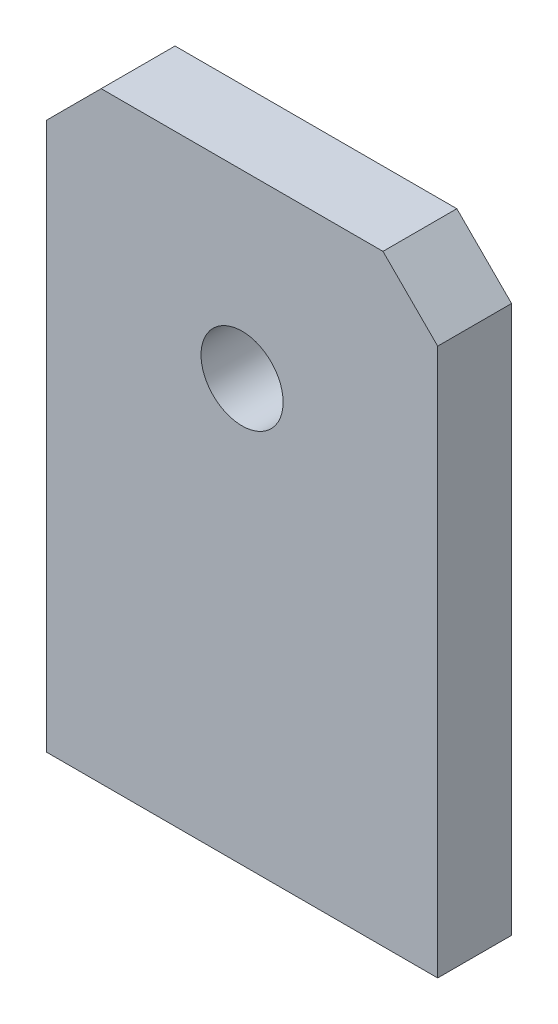
ISO-10303-21;
HEADER;
FILE_DESCRIPTION(('STEP AP214'),'2;1');
FILE_NAME('part.step','',(''),(''),'','','');
FILE_SCHEMA(('AUTOMOTIVE_DESIGN { 1 0 10303 214 1 1 1 1 }'));
ENDSEC;
DATA;
#1=APPLICATION_CONTEXT('core data for automotive mechanical design processes');
#2=APPLICATION_PROTOCOL_DEFINITION('international standard','automotive_design',2000,#1);
#3=PRODUCT_CONTEXT('',#1,'mechanical');
#4=PRODUCT('Part','Part','',(#3));
#5=PRODUCT_RELATED_PRODUCT_CATEGORY('part','',(#4));
#6=PRODUCT_DEFINITION_FORMATION('','',#4);
#7=PRODUCT_DEFINITION_CONTEXT('part definition',#1,'design');
#8=PRODUCT_DEFINITION('design','',#6,#7);
#9=PRODUCT_DEFINITION_SHAPE('','',#8);
#10=(LENGTH_UNIT() NAMED_UNIT(*) SI_UNIT(.MILLI.,.METRE.));
#11=(NAMED_UNIT(*) PLANE_ANGLE_UNIT() SI_UNIT($,.RADIAN.));
#12=(NAMED_UNIT(*) SI_UNIT($,.STERADIAN.) SOLID_ANGLE_UNIT());
#13=UNCERTAINTY_MEASURE_WITH_UNIT(LENGTH_MEASURE(1.E-05),#10,'distance_accuracy_value','');
#14=(GEOMETRIC_REPRESENTATION_CONTEXT(3) GLOBAL_UNCERTAINTY_ASSIGNED_CONTEXT((#13)) GLOBAL_UNIT_ASSIGNED_CONTEXT((#10,
#11,#12)) REPRESENTATION_CONTEXT('',''));
#15=CARTESIAN_POINT('',(0.,0.,0.));
#16=DIRECTION('',(0.,0.,1.));
#17=DIRECTION('',(1.,0.,0.));
#18=AXIS2_PLACEMENT_3D('',#15,#16,#17);
#19=CARTESIAN_POINT('',(0.,0.,13.5));
#20=DIRECTION('',(0.,0.,-1.));
#21=DIRECTION('',(-1.,0.,0.));
#22=AXIS2_PLACEMENT_3D('',#19,#20,#21);
#23=PLANE('',#22);
#24=DIRECTION('',(-1.,0.,0.));
#25=VECTOR('',#24,1.);
#26=CARTESIAN_POINT('',(0.,110.,13.5));
#27=LINE('',#26,#25);
#28=CARTESIAN_POINT('',(61.5,110.,13.5));
#29=VERTEX_POINT('',#28);
#30=CARTESIAN_POINT('',(10.,110.,13.5));
#31=VERTEX_POINT('',#30);
#32=EDGE_CURVE('E114',#29,#31,#27,.T.);
#33=ORIENTED_EDGE('',*,*,#32,.T.);
#34=DIRECTION('',(0.707106781186549,0.707106781186547,0.));
#35=VECTOR('',#34,1.);
#36=CARTESIAN_POINT('',(0.,100.,13.5));
#37=LINE('',#36,#35);
#38=CARTESIAN_POINT('',(0.,100.,13.5));
#39=VERTEX_POINT('',#38);
#40=EDGE_CURVE('E40',#31,#39,#37,.F.);
#41=ORIENTED_EDGE('',*,*,#40,.T.);
#42=DIRECTION('',(0.,-1.,0.));
#43=VECTOR('',#42,1.);
#44=CARTESIAN_POINT('',(0.,0.,13.5));
#45=LINE('',#44,#43);
#46=CARTESIAN_POINT('',(0.,0.,13.5));
#47=VERTEX_POINT('',#46);
#48=EDGE_CURVE('E86',#39,#47,#45,.T.);
#49=ORIENTED_EDGE('',*,*,#48,.T.);
#50=DIRECTION('',(1.,0.,0.));
#51=VECTOR('',#50,1.);
#52=CARTESIAN_POINT('',(0.,0.,13.5));
#53=LINE('',#52,#51);
#54=CARTESIAN_POINT('',(71.5,0.,13.5));
#55=VERTEX_POINT('',#54);
#56=EDGE_CURVE('E89',#47,#55,#53,.T.);
#57=ORIENTED_EDGE('',*,*,#56,.T.);
#58=DIRECTION('',(0.,1.,0.));
#59=VECTOR('',#58,1.);
#60=CARTESIAN_POINT('',(71.5,0.,13.5));
#61=LINE('',#60,#59);
#62=CARTESIAN_POINT('',(71.5,100.,13.5));
#63=VERTEX_POINT('',#62);
#64=EDGE_CURVE('E104',#55,#63,#61,.T.);
#65=ORIENTED_EDGE('',*,*,#64,.T.);
#66=DIRECTION('',(0.707106781186547,-0.707106781186549,0.));
#67=VECTOR('',#66,1.);
#68=CARTESIAN_POINT('',(61.5,110.,13.5));
#69=LINE('',#68,#67);
#70=EDGE_CURVE('E125',#63,#29,#69,.F.);
#71=ORIENTED_EDGE('',*,*,#70,.T.);
#72=EDGE_LOOP('',(#33,#41,#49,#57,#65,#71));
#73=FACE_BOUND('',#72,.T.);
#74=CARTESIAN_POINT('',(35.75,77.,13.5));
#75=DIRECTION('',(0.,0.,1.));
#76=DIRECTION('',(1.,0.,0.));
#77=AXIS2_PLACEMENT_3D('',#74,#75,#76);
#78=CIRCLE('',#77,7.5);
#79=CARTESIAN_POINT('',(43.25,77.,13.5));
#80=VERTEX_POINT('',#79);
#81=EDGE_CURVE('E142',#80,#80,#78,.T.);
#82=ORIENTED_EDGE('',*,*,#81,.F.);
#83=EDGE_LOOP('',(#82));
#84=FACE_BOUND('',#83,.T.);
#85=ADVANCED_FACE('F32',(#73,#84),#23,.F.);
#86=CARTESIAN_POINT('',(0.,0.,0.));
#87=DIRECTION('',(0.,0.,-1.));
#88=DIRECTION('',(-1.,0.,0.));
#89=AXIS2_PLACEMENT_3D('',#86,#87,#88);
#90=PLANE('',#89);
#91=DIRECTION('',(0.,-1.,0.));
#92=VECTOR('',#91,1.);
#93=CARTESIAN_POINT('',(0.,0.,0.));
#94=LINE('',#93,#92);
#95=CARTESIAN_POINT('',(0.,100.,0.));
#96=VERTEX_POINT('',#95);
#97=CARTESIAN_POINT('',(0.,0.,0.));
#98=VERTEX_POINT('',#97);
#99=EDGE_CURVE('E108',#96,#98,#94,.T.);
#100=ORIENTED_EDGE('',*,*,#99,.F.);
#101=DIRECTION('',(-0.707106781186549,-0.707106781186547,0.));
#102=VECTOR('',#101,1.);
#103=CARTESIAN_POINT('',(-50.,50.0000000000001,0.));
#104=LINE('',#103,#102);
#105=CARTESIAN_POINT('',(10.,110.,0.));
#106=VERTEX_POINT('',#105);
#107=EDGE_CURVE('E119',#96,#106,#104,.F.);
#108=ORIENTED_EDGE('',*,*,#107,.T.);
#109=DIRECTION('',(-1.,0.,0.));
#110=VECTOR('',#109,1.);
#111=CARTESIAN_POINT('',(0.,110.,0.));
#112=LINE('',#111,#110);
#113=CARTESIAN_POINT('',(61.5,110.,0.));
#114=VERTEX_POINT('',#113);
#115=EDGE_CURVE('E96',#114,#106,#112,.T.);
#116=ORIENTED_EDGE('',*,*,#115,.F.);
#117=DIRECTION('',(-0.707106781186547,0.707106781186549,0.));
#118=VECTOR('',#117,1.);
#119=CARTESIAN_POINT('',(85.7500000000001,85.7499999999998,0.));
#120=LINE('',#119,#118);
#121=CARTESIAN_POINT('',(71.5,100.,0.));
#122=VERTEX_POINT('',#121);
#123=EDGE_CURVE('E112',#114,#122,#120,.F.);
#124=ORIENTED_EDGE('',*,*,#123,.T.);
#125=DIRECTION('',(0.,1.,0.));
#126=VECTOR('',#125,1.);
#127=CARTESIAN_POINT('',(71.5,0.,0.));
#128=LINE('',#127,#126);
#129=CARTESIAN_POINT('',(71.5,0.,0.));
#130=VERTEX_POINT('',#129);
#131=EDGE_CURVE('E136',#130,#122,#128,.T.);
#132=ORIENTED_EDGE('',*,*,#131,.F.);
#133=DIRECTION('',(1.,0.,0.));
#134=VECTOR('',#133,1.);
#135=CARTESIAN_POINT('',(0.,0.,0.));
#136=LINE('',#135,#134);
#137=EDGE_CURVE('E138',#98,#130,#136,.T.);
#138=ORIENTED_EDGE('',*,*,#137,.F.);
#139=EDGE_LOOP('',(#100,#108,#116,#124,#132,#138));
#140=FACE_BOUND('',#139,.T.);
#141=CARTESIAN_POINT('',(35.75,77.,0.));
#142=DIRECTION('',(0.,0.,1.));
#143=DIRECTION('',(1.,0.,0.));
#144=AXIS2_PLACEMENT_3D('',#141,#142,#143);
#145=CIRCLE('',#144,7.5);
#146=CARTESIAN_POINT('',(43.25,77.,0.));
#147=VERTEX_POINT('',#146);
#148=EDGE_CURVE('E145',#147,#147,#145,.T.);
#149=ORIENTED_EDGE('',*,*,#148,.T.);
#150=EDGE_LOOP('',(#149));
#151=FACE_BOUND('',#150,.T.);
#152=ADVANCED_FACE('F134',(#140,#151),#90,.T.);
#153=CARTESIAN_POINT('',(0.,0.,13.5));
#154=DIRECTION('',(1.,0.,0.));
#155=DIRECTION('',(0.,0.,-1.));
#156=AXIS2_PLACEMENT_3D('',#153,#154,#155);
#157=PLANE('',#156);
#158=ORIENTED_EDGE('',*,*,#48,.F.);
#159=DIRECTION('',(0.,0.,-1.));
#160=VECTOR('',#159,1.);
#161=CARTESIAN_POINT('',(0.,100.,13.5));
#162=LINE('',#161,#160);
#163=EDGE_CURVE('E110',#39,#96,#162,.T.);
#164=ORIENTED_EDGE('',*,*,#163,.T.);
#165=ORIENTED_EDGE('',*,*,#99,.T.);
#166=DIRECTION('',(0.,0.,-1.));
#167=VECTOR('',#166,1.);
#168=CARTESIAN_POINT('',(0.,0.,13.5));
#169=LINE('',#168,#167);
#170=EDGE_CURVE('E101',#47,#98,#169,.T.);
#171=ORIENTED_EDGE('',*,*,#170,.F.);
#172=EDGE_LOOP('',(#158,#164,#165,#171));
#173=FACE_BOUND('',#172,.T.);
#174=ADVANCED_FACE('F106',(#173),#157,.F.);
#175=CARTESIAN_POINT('',(0.,0.,13.5));
#176=DIRECTION('',(0.,1.,0.));
#177=DIRECTION('',(-1.,0.,0.));
#178=AXIS2_PLACEMENT_3D('',#175,#176,#177);
#179=PLANE('',#178);
#180=CARTESIAN_POINT('',(55.75,0.,6.75));
#181=DIRECTION('',(0.,-1.,0.));
#182=DIRECTION('',(1.,0.,0.));
#183=AXIS2_PLACEMENT_3D('',#180,#181,#182);
#184=CIRCLE('',#183,4.);
#185=CARTESIAN_POINT('',(59.75,0.,6.75));
#186=VERTEX_POINT('',#185);
#187=EDGE_CURVE('E157',#186,#186,#184,.T.);
#188=ORIENTED_EDGE('',*,*,#187,.F.);
#189=EDGE_LOOP('',(#188));
#190=FACE_BOUND('',#189,.T.);
#191=CARTESIAN_POINT('',(15.75,0.,6.75));
#192=DIRECTION('',(0.,-1.,0.));
#193=DIRECTION('',(1.,0.,0.));
#194=AXIS2_PLACEMENT_3D('',#191,#192,#193);
#195=CIRCLE('',#194,4.);
#196=CARTESIAN_POINT('',(19.75,0.,6.75));
#197=VERTEX_POINT('',#196);
#198=EDGE_CURVE('E151',#197,#197,#195,.T.);
#199=ORIENTED_EDGE('',*,*,#198,.F.);
#200=EDGE_LOOP('',(#199));
#201=FACE_BOUND('',#200,.T.);
#202=ORIENTED_EDGE('',*,*,#137,.T.);
#203=DIRECTION('',(0.,0.,-1.));
#204=VECTOR('',#203,1.);
#205=CARTESIAN_POINT('',(71.5,0.,13.5));
#206=LINE('',#205,#204);
#207=EDGE_CURVE('E103',#55,#130,#206,.T.);
#208=ORIENTED_EDGE('',*,*,#207,.F.);
#209=ORIENTED_EDGE('',*,*,#56,.F.);
#210=ORIENTED_EDGE('',*,*,#170,.T.);
#211=EDGE_LOOP('',(#202,#208,#209,#210));
#212=FACE_BOUND('',#211,.T.);
#213=ADVANCED_FACE('F100',(#190,#201,#212),#179,.F.);
#214=CARTESIAN_POINT('',(71.5,0.,13.5));
#215=DIRECTION('',(-1.,0.,0.));
#216=DIRECTION('',(0.,-1.,0.));
#217=AXIS2_PLACEMENT_3D('',#214,#215,#216);
#218=PLANE('',#217);
#219=ORIENTED_EDGE('',*,*,#131,.T.);
#220=DIRECTION('',(0.,0.,1.));
#221=VECTOR('',#220,1.);
#222=CARTESIAN_POINT('',(71.5,100.,13.5));
#223=LINE('',#222,#221);
#224=EDGE_CURVE('E11',#122,#63,#223,.T.);
#225=ORIENTED_EDGE('',*,*,#224,.T.);
#226=ORIENTED_EDGE('',*,*,#64,.F.);
#227=ORIENTED_EDGE('',*,*,#207,.T.);
#228=EDGE_LOOP('',(#219,#225,#226,#227));
#229=FACE_BOUND('',#228,.T.);
#230=ADVANCED_FACE('F137',(#229),#218,.F.);
#231=CARTESIAN_POINT('',(0.,110.,13.5));
#232=DIRECTION('',(0.,-1.,0.));
#233=DIRECTION('',(1.,0.,0.));
#234=AXIS2_PLACEMENT_3D('',#231,#232,#233);
#235=PLANE('',#234);
#236=ORIENTED_EDGE('',*,*,#115,.T.);
#237=DIRECTION('',(0.,0.,1.));
#238=VECTOR('',#237,1.);
#239=CARTESIAN_POINT('',(10.,110.,13.5));
#240=LINE('',#239,#238);
#241=EDGE_CURVE('E53',#106,#31,#240,.T.);
#242=ORIENTED_EDGE('',*,*,#241,.T.);
#243=ORIENTED_EDGE('',*,*,#32,.F.);
#244=DIRECTION('',(0.,0.,-1.));
#245=VECTOR('',#244,1.);
#246=CARTESIAN_POINT('',(61.5,110.,13.5));
#247=LINE('',#246,#245);
#248=EDGE_CURVE('E121',#29,#114,#247,.T.);
#249=ORIENTED_EDGE('',*,*,#248,.T.);
#250=EDGE_LOOP('',(#236,#242,#243,#249));
#251=FACE_BOUND('',#250,.T.);
#252=ADVANCED_FACE('F129',(#251),#235,.F.);
#253=CARTESIAN_POINT('',(35.75,77.,13.5));
#254=DIRECTION('',(0.,0.,-1.));
#255=DIRECTION('',(-1.,0.,0.));
#256=AXIS2_PLACEMENT_3D('',#253,#254,#255);
#257=CYLINDRICAL_SURFACE('',#256,7.5);
#258=ORIENTED_EDGE('',*,*,#81,.T.);
#259=EDGE_LOOP('',(#258));
#260=FACE_BOUND('',#259,.T.);
#261=ORIENTED_EDGE('',*,*,#148,.F.);
#262=EDGE_LOOP('',(#261));
#263=FACE_BOUND('',#262,.T.);
#264=ADVANCED_FACE('F196',(#260,#263),#257,.F.);
#265=CARTESIAN_POINT('',(0.,100.,13.5));
#266=DIRECTION('',(0.707106781186546,-0.707106781186548,0.));
#267=DIRECTION('',(0.,0.,-1.));
#268=AXIS2_PLACEMENT_3D('',#265,#266,#267);
#269=PLANE('',#268);
#270=ORIENTED_EDGE('',*,*,#40,.F.);
#271=ORIENTED_EDGE('',*,*,#241,.F.);
#272=ORIENTED_EDGE('',*,*,#107,.F.);
#273=ORIENTED_EDGE('',*,*,#163,.F.);
#274=EDGE_LOOP('',(#270,#271,#272,#273));
#275=FACE_BOUND('',#274,.T.);
#276=ADVANCED_FACE('F187',(#275),#269,.F.);
#277=CARTESIAN_POINT('',(61.5,110.,13.5));
#278=DIRECTION('',(-0.707106781186548,-0.707106781186546,0.));
#279=DIRECTION('',(0.,0.,-1.));
#280=AXIS2_PLACEMENT_3D('',#277,#278,#279);
#281=PLANE('',#280);
#282=ORIENTED_EDGE('',*,*,#70,.F.);
#283=ORIENTED_EDGE('',*,*,#224,.F.);
#284=ORIENTED_EDGE('',*,*,#123,.F.);
#285=ORIENTED_EDGE('',*,*,#248,.F.);
#286=EDGE_LOOP('',(#282,#283,#284,#285));
#287=FACE_BOUND('',#286,.T.);
#288=ADVANCED_FACE('F34',(#287),#281,.F.);
#289=CARTESIAN_POINT('',(15.75,11.,6.75));
#290=DIRECTION('',(0.,-1.,0.));
#291=DIRECTION('',(1.,0.,0.));
#292=AXIS2_PLACEMENT_3D('',#289,#290,#291);
#293=CYLINDRICAL_SURFACE('',#292,4.);
#294=CARTESIAN_POINT('',(15.75,11.,6.75));
#295=DIRECTION('',(0.,-1.,0.));
#296=DIRECTION('',(1.,0.,0.));
#297=AXIS2_PLACEMENT_3D('',#294,#295,#296);
#298=CIRCLE('',#297,4.);
#299=CARTESIAN_POINT('',(19.75,11.,6.75));
#300=VERTEX_POINT('',#299);
#301=EDGE_CURVE('E148',#300,#300,#298,.T.);
#302=ORIENTED_EDGE('',*,*,#301,.F.);
#303=EDGE_LOOP('',(#302));
#304=FACE_BOUND('',#303,.T.);
#305=ORIENTED_EDGE('',*,*,#198,.T.);
#306=EDGE_LOOP('',(#305));
#307=FACE_BOUND('',#306,.T.);
#308=ADVANCED_FACE('F177',(#304,#307),#293,.F.);
#309=CARTESIAN_POINT('',(15.75,11.,6.75));
#310=DIRECTION('',(0.,-1.,0.));
#311=DIRECTION('',(1.,0.,0.));
#312=AXIS2_PLACEMENT_3D('',#309,#310,#311);
#313=PLANE('',#312);
#314=ORIENTED_EDGE('',*,*,#301,.T.);
#315=EDGE_LOOP('',(#314));
#316=FACE_BOUND('',#315,.T.);
#317=ADVANCED_FACE('F168',(#316),#313,.T.);
#318=CARTESIAN_POINT('',(55.75,11.,6.75));
#319=DIRECTION('',(0.,-1.,0.));
#320=DIRECTION('',(1.,0.,0.));
#321=AXIS2_PLACEMENT_3D('',#318,#319,#320);
#322=CYLINDRICAL_SURFACE('',#321,4.);
#323=CARTESIAN_POINT('',(55.75,11.,6.75));
#324=DIRECTION('',(0.,-1.,0.));
#325=DIRECTION('',(1.,0.,0.));
#326=AXIS2_PLACEMENT_3D('',#323,#324,#325);
#327=CIRCLE('',#326,4.);
#328=CARTESIAN_POINT('',(59.75,11.,6.75));
#329=VERTEX_POINT('',#328);
#330=EDGE_CURVE('E154',#329,#329,#327,.T.);
#331=ORIENTED_EDGE('',*,*,#330,.F.);
#332=EDGE_LOOP('',(#331));
#333=FACE_BOUND('',#332,.T.);
#334=ORIENTED_EDGE('',*,*,#187,.T.);
#335=EDGE_LOOP('',(#334));
#336=FACE_BOUND('',#335,.T.);
#337=ADVANCED_FACE('F165',(#333,#336),#322,.F.);
#338=CARTESIAN_POINT('',(55.75,11.,6.75));
#339=DIRECTION('',(0.,-1.,0.));
#340=DIRECTION('',(1.,0.,0.));
#341=AXIS2_PLACEMENT_3D('',#338,#339,#340);
#342=PLANE('',#341);
#343=ORIENTED_EDGE('',*,*,#330,.T.);
#344=EDGE_LOOP('',(#343));
#345=FACE_BOUND('',#344,.T.);
#346=ADVANCED_FACE('F163',(#345),#342,.T.);
#347=CLOSED_SHELL('',(#85,#152,#174,#213,#230,#252,#264,#276,#288,#308,#317,#337,#346));
#348=MANIFOLD_SOLID_BREP('B2',#347);
#349=ADVANCED_BREP_SHAPE_REPRESENTATION('',(#18,#348),#14);
#350=SHAPE_DEFINITION_REPRESENTATION(#9,#349);
ENDSEC;
END-ISO-10303-21;
